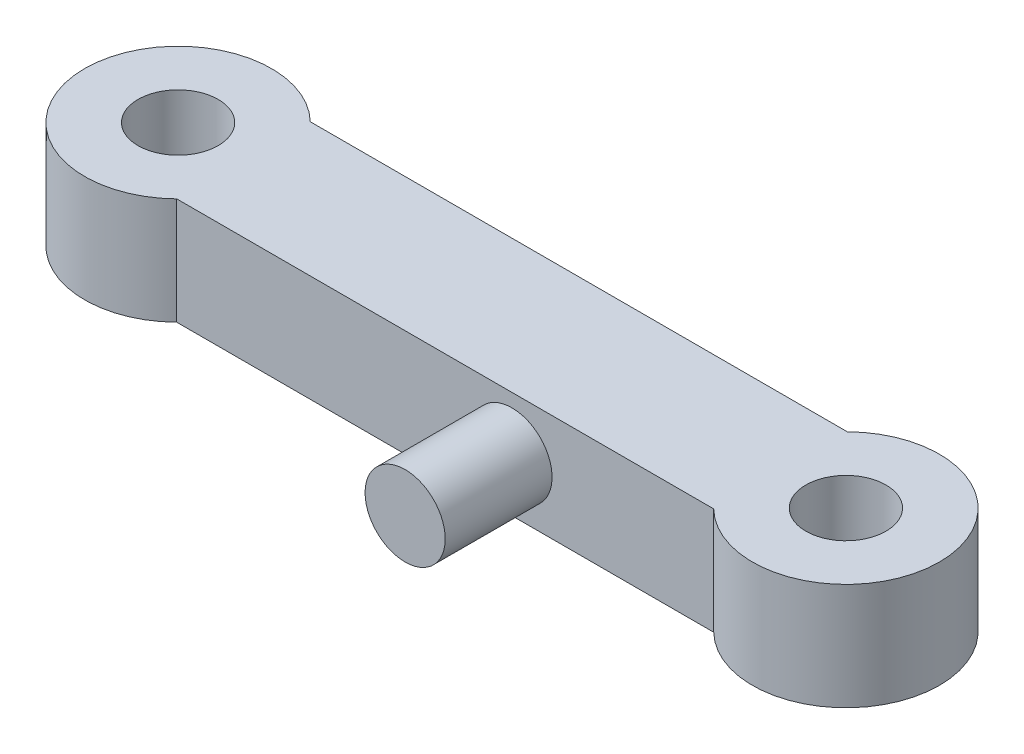
ISO-10303-21;
HEADER;
FILE_DESCRIPTION(('STEP AP214'),'2;1');
FILE_NAME('part.step','',(''),(''),'','','');
FILE_SCHEMA(('AUTOMOTIVE_DESIGN { 1 0 10303 214 1 1 1 1 }'));
ENDSEC;
DATA;
#1=APPLICATION_CONTEXT('core data for automotive mechanical design processes');
#2=APPLICATION_PROTOCOL_DEFINITION('international standard','automotive_design',2000,#1);
#3=PRODUCT_CONTEXT('',#1,'mechanical');
#4=PRODUCT('Part','Part','',(#3));
#5=PRODUCT_RELATED_PRODUCT_CATEGORY('part','',(#4));
#6=PRODUCT_DEFINITION_FORMATION('','',#4);
#7=PRODUCT_DEFINITION_CONTEXT('part definition',#1,'design');
#8=PRODUCT_DEFINITION('design','',#6,#7);
#9=PRODUCT_DEFINITION_SHAPE('','',#8);
#10=(LENGTH_UNIT() NAMED_UNIT(*) SI_UNIT(.MILLI.,.METRE.));
#11=(NAMED_UNIT(*) PLANE_ANGLE_UNIT() SI_UNIT($,.RADIAN.));
#12=(NAMED_UNIT(*) SI_UNIT($,.STERADIAN.) SOLID_ANGLE_UNIT());
#13=UNCERTAINTY_MEASURE_WITH_UNIT(LENGTH_MEASURE(1.E-05),#10,'distance_accuracy_value','');
#14=(GEOMETRIC_REPRESENTATION_CONTEXT(3) GLOBAL_UNCERTAINTY_ASSIGNED_CONTEXT((#13)) GLOBAL_UNIT_ASSIGNED_CONTEXT((#10,
#11,#12)) REPRESENTATION_CONTEXT('',''));
#15=CARTESIAN_POINT('',(0.,0.,0.));
#16=DIRECTION('',(0.,0.,1.));
#17=DIRECTION('',(1.,0.,0.));
#18=AXIS2_PLACEMENT_3D('',#15,#16,#17);
#19=CARTESIAN_POINT('',(12.5,4.,0.));
#20=DIRECTION('',(0.,-1.,0.));
#21=DIRECTION('',(0.,0.,-1.));
#22=AXIS2_PLACEMENT_3D('',#19,#20,#21);
#23=PLANE('',#22);
#24=CARTESIAN_POINT('',(12.5,4.,0.));
#25=DIRECTION('',(0.,1.,0.));
#26=DIRECTION('',(0.,0.,-1.));
#27=AXIS2_PLACEMENT_3D('',#24,#25,#26);
#28=CIRCLE('',#27,3.5);
#29=CARTESIAN_POINT('',(10.0505102572168,4.,2.5));
#30=VERTEX_POINT('',#29);
#31=CARTESIAN_POINT('',(10.0505102572168,4.,-2.5));
#32=VERTEX_POINT('',#31);
#33=EDGE_CURVE('E99',#30,#32,#28,.T.);
#34=ORIENTED_EDGE('',*,*,#33,.T.);
#35=DIRECTION('',(-1.,0.,0.));
#36=VECTOR('',#35,1.);
#37=CARTESIAN_POINT('',(-10.0505102572168,4.,-2.5));
#38=LINE('',#37,#36);
#39=CARTESIAN_POINT('',(-10.0505102572168,4.,-2.5));
#40=VERTEX_POINT('',#39);
#41=EDGE_CURVE('E94',#32,#40,#38,.T.);
#42=ORIENTED_EDGE('',*,*,#41,.T.);
#43=CARTESIAN_POINT('',(-12.5,4.,0.));
#44=DIRECTION('',(0.,1.,0.));
#45=DIRECTION('',(0.,0.,-1.));
#46=AXIS2_PLACEMENT_3D('',#43,#44,#45);
#47=CIRCLE('',#46,3.5);
#48=CARTESIAN_POINT('',(-10.0505102572168,4.,2.5));
#49=VERTEX_POINT('',#48);
#50=EDGE_CURVE('E97',#40,#49,#47,.T.);
#51=ORIENTED_EDGE('',*,*,#50,.T.);
#52=DIRECTION('',(1.,0.,0.));
#53=VECTOR('',#52,1.);
#54=CARTESIAN_POINT('',(-10.0505102572168,4.,2.5));
#55=LINE('',#54,#53);
#56=EDGE_CURVE('E63',#49,#30,#55,.T.);
#57=ORIENTED_EDGE('',*,*,#56,.T.);
#58=EDGE_LOOP('',(#34,#42,#51,#57));
#59=FACE_BOUND('',#58,.T.);
#60=CARTESIAN_POINT('',(12.5,4.,0.));
#61=DIRECTION('',(0.,1.,0.));
#62=DIRECTION('',(0.,0.,1.));
#63=AXIS2_PLACEMENT_3D('',#60,#61,#62);
#64=CIRCLE('',#63,1.5);
#65=CARTESIAN_POINT('',(12.5,4.,1.5));
#66=VERTEX_POINT('',#65);
#67=EDGE_CURVE('E121',#66,#66,#64,.T.);
#68=ORIENTED_EDGE('',*,*,#67,.F.);
#69=EDGE_LOOP('',(#68));
#70=FACE_BOUND('',#69,.T.);
#71=CARTESIAN_POINT('',(-12.5,4.,0.));
#72=DIRECTION('',(0.,1.,0.));
#73=DIRECTION('',(0.,0.,1.));
#74=AXIS2_PLACEMENT_3D('',#71,#72,#73);
#75=CIRCLE('',#74,1.5);
#76=CARTESIAN_POINT('',(-12.5,4.,1.5));
#77=VERTEX_POINT('',#76);
#78=EDGE_CURVE('E145',#77,#77,#75,.T.);
#79=ORIENTED_EDGE('',*,*,#78,.F.);
#80=EDGE_LOOP('',(#79));
#81=FACE_BOUND('',#80,.T.);
#82=ADVANCED_FACE('F45',(#59,#70,#81),#23,.F.);
#83=CARTESIAN_POINT('',(12.5,0.,0.));
#84=DIRECTION('',(0.,-1.,0.));
#85=DIRECTION('',(0.,0.,-1.));
#86=AXIS2_PLACEMENT_3D('',#83,#84,#85);
#87=PLANE('',#86);
#88=CARTESIAN_POINT('',(12.5,0.,0.));
#89=DIRECTION('',(0.,1.,0.));
#90=DIRECTION('',(0.,0.,1.));
#91=AXIS2_PLACEMENT_3D('',#88,#89,#90);
#92=CIRCLE('',#91,1.5);
#93=CARTESIAN_POINT('',(12.5,0.,1.5));
#94=VERTEX_POINT('',#93);
#95=EDGE_CURVE('E151',#94,#94,#92,.T.);
#96=ORIENTED_EDGE('',*,*,#95,.T.);
#97=EDGE_LOOP('',(#96));
#98=FACE_BOUND('',#97,.T.);
#99=CARTESIAN_POINT('',(12.5,0.,0.));
#100=DIRECTION('',(0.,1.,0.));
#101=DIRECTION('',(0.,0.,-1.));
#102=AXIS2_PLACEMENT_3D('',#99,#100,#101);
#103=CIRCLE('',#102,3.5);
#104=CARTESIAN_POINT('',(10.0505102572168,0.,2.5));
#105=VERTEX_POINT('',#104);
#106=CARTESIAN_POINT('',(10.0505102572168,0.,-2.5));
#107=VERTEX_POINT('',#106);
#108=EDGE_CURVE('E117',#105,#107,#103,.T.);
#109=ORIENTED_EDGE('',*,*,#108,.F.);
#110=DIRECTION('',(1.,0.,0.));
#111=VECTOR('',#110,1.);
#112=CARTESIAN_POINT('',(-10.0505102572168,0.,2.5));
#113=LINE('',#112,#111);
#114=CARTESIAN_POINT('',(-10.0505102572168,0.,2.5));
#115=VERTEX_POINT('',#114);
#116=EDGE_CURVE('E86',#115,#105,#113,.T.);
#117=ORIENTED_EDGE('',*,*,#116,.F.);
#118=CARTESIAN_POINT('',(-12.5,0.,0.));
#119=DIRECTION('',(0.,1.,0.));
#120=DIRECTION('',(0.,0.,-1.));
#121=AXIS2_PLACEMENT_3D('',#118,#119,#120);
#122=CIRCLE('',#121,3.5);
#123=CARTESIAN_POINT('',(-10.0505102572168,0.,-2.5));
#124=VERTEX_POINT('',#123);
#125=EDGE_CURVE('E80',#124,#115,#122,.T.);
#126=ORIENTED_EDGE('',*,*,#125,.F.);
#127=DIRECTION('',(-1.,0.,0.));
#128=VECTOR('',#127,1.);
#129=CARTESIAN_POINT('',(-10.0505102572168,0.,-2.5));
#130=LINE('',#129,#128);
#131=EDGE_CURVE('E105',#107,#124,#130,.T.);
#132=ORIENTED_EDGE('',*,*,#131,.F.);
#133=EDGE_LOOP('',(#109,#117,#126,#132));
#134=FACE_BOUND('',#133,.T.);
#135=CARTESIAN_POINT('',(-12.5,0.,0.));
#136=DIRECTION('',(0.,1.,0.));
#137=DIRECTION('',(0.,0.,1.));
#138=AXIS2_PLACEMENT_3D('',#135,#136,#137);
#139=CIRCLE('',#138,1.5);
#140=CARTESIAN_POINT('',(-12.5,0.,1.5));
#141=VERTEX_POINT('',#140);
#142=EDGE_CURVE('E142',#141,#141,#139,.T.);
#143=ORIENTED_EDGE('',*,*,#142,.T.);
#144=EDGE_LOOP('',(#143));
#145=FACE_BOUND('',#144,.T.);
#146=ADVANCED_FACE('F135',(#98,#134,#145),#87,.T.);
#147=CARTESIAN_POINT('',(12.5,4.,0.));
#148=DIRECTION('',(0.,-1.,0.));
#149=DIRECTION('',(0.,0.,-1.));
#150=AXIS2_PLACEMENT_3D('',#147,#148,#149);
#151=CYLINDRICAL_SURFACE('',#150,3.5);
#152=ORIENTED_EDGE('',*,*,#108,.T.);
#153=DIRECTION('',(0.,-1.,0.));
#154=VECTOR('',#153,1.);
#155=CARTESIAN_POINT('',(10.0505102572168,4.,-2.5));
#156=LINE('',#155,#154);
#157=EDGE_CURVE('E55',#32,#107,#156,.T.);
#158=ORIENTED_EDGE('',*,*,#157,.F.);
#159=ORIENTED_EDGE('',*,*,#33,.F.);
#160=DIRECTION('',(0.,-1.,0.));
#161=VECTOR('',#160,1.);
#162=CARTESIAN_POINT('',(10.0505102572168,4.,2.5));
#163=LINE('',#162,#161);
#164=EDGE_CURVE('E113',#30,#105,#163,.T.);
#165=ORIENTED_EDGE('',*,*,#164,.T.);
#166=EDGE_LOOP('',(#152,#158,#159,#165));
#167=FACE_BOUND('',#166,.T.);
#168=ADVANCED_FACE('F47',(#167),#151,.T.);
#169=CARTESIAN_POINT('',(-10.0505102572168,4.,-2.5));
#170=DIRECTION('',(0.,0.,1.));
#171=DIRECTION('',(1.,0.,0.));
#172=AXIS2_PLACEMENT_3D('',#169,#170,#171);
#173=PLANE('',#172);
#174=ORIENTED_EDGE('',*,*,#131,.T.);
#175=DIRECTION('',(0.,-1.,0.));
#176=VECTOR('',#175,1.);
#177=CARTESIAN_POINT('',(-10.0505102572168,4.,-2.5));
#178=LINE('',#177,#176);
#179=EDGE_CURVE('E103',#40,#124,#178,.T.);
#180=ORIENTED_EDGE('',*,*,#179,.F.);
#181=ORIENTED_EDGE('',*,*,#41,.F.);
#182=ORIENTED_EDGE('',*,*,#157,.T.);
#183=EDGE_LOOP('',(#174,#180,#181,#182));
#184=FACE_BOUND('',#183,.T.);
#185=ADVANCED_FACE('F104',(#184),#173,.F.);
#186=CARTESIAN_POINT('',(-12.5,4.,0.));
#187=DIRECTION('',(0.,-1.,0.));
#188=DIRECTION('',(0.,0.,-1.));
#189=AXIS2_PLACEMENT_3D('',#186,#187,#188);
#190=CYLINDRICAL_SURFACE('',#189,3.5);
#191=ORIENTED_EDGE('',*,*,#125,.T.);
#192=DIRECTION('',(0.,-1.,0.));
#193=VECTOR('',#192,1.);
#194=CARTESIAN_POINT('',(-10.0505102572168,4.,2.5));
#195=LINE('',#194,#193);
#196=EDGE_CURVE('E107',#49,#115,#195,.T.);
#197=ORIENTED_EDGE('',*,*,#196,.F.);
#198=ORIENTED_EDGE('',*,*,#50,.F.);
#199=ORIENTED_EDGE('',*,*,#179,.T.);
#200=EDGE_LOOP('',(#191,#197,#198,#199));
#201=FACE_BOUND('',#200,.T.);
#202=ADVANCED_FACE('F109',(#201),#190,.T.);
#203=CARTESIAN_POINT('',(-10.0505102572168,4.,2.5));
#204=DIRECTION('',(0.,0.,-1.));
#205=DIRECTION('',(-1.,0.,0.));
#206=AXIS2_PLACEMENT_3D('',#203,#204,#205);
#207=PLANE('',#206);
#208=CARTESIAN_POINT('',(2.49999999999995,2.,2.5));
#209=DIRECTION('',(0.,0.,-1.));
#210=DIRECTION('',(-1.,0.,0.));
#211=AXIS2_PLACEMENT_3D('',#208,#209,#210);
#212=CIRCLE('',#211,1.5);
#213=CARTESIAN_POINT('',(0.999999999999946,2.,2.5));
#214=VERTEX_POINT('',#213);
#215=EDGE_CURVE('E11',#214,#214,#212,.F.);
#216=ORIENTED_EDGE('',*,*,#215,.F.);
#217=EDGE_LOOP('',(#216));
#218=FACE_BOUND('',#217,.T.);
#219=ORIENTED_EDGE('',*,*,#116,.T.);
#220=ORIENTED_EDGE('',*,*,#164,.F.);
#221=ORIENTED_EDGE('',*,*,#56,.F.);
#222=ORIENTED_EDGE('',*,*,#196,.T.);
#223=EDGE_LOOP('',(#219,#220,#221,#222));
#224=FACE_BOUND('',#223,.T.);
#225=ADVANCED_FACE('F167',(#218,#224),#207,.F.);
#226=CARTESIAN_POINT('',(12.5,4.,0.));
#227=DIRECTION('',(0.,-1.,0.));
#228=DIRECTION('',(0.,0.,-1.));
#229=AXIS2_PLACEMENT_3D('',#226,#227,#228);
#230=CYLINDRICAL_SURFACE('',#229,1.5);
#231=ORIENTED_EDGE('',*,*,#67,.T.);
#232=EDGE_LOOP('',(#231));
#233=FACE_BOUND('',#232,.T.);
#234=ORIENTED_EDGE('',*,*,#95,.F.);
#235=EDGE_LOOP('',(#234));
#236=FACE_BOUND('',#235,.T.);
#237=ADVANCED_FACE('F164',(#233,#236),#230,.F.);
#238=CARTESIAN_POINT('',(-12.5,4.,0.));
#239=DIRECTION('',(0.,-1.,0.));
#240=DIRECTION('',(0.,0.,-1.));
#241=AXIS2_PLACEMENT_3D('',#238,#239,#240);
#242=CYLINDRICAL_SURFACE('',#241,1.5);
#243=ORIENTED_EDGE('',*,*,#78,.T.);
#244=EDGE_LOOP('',(#243));
#245=FACE_BOUND('',#244,.T.);
#246=ORIENTED_EDGE('',*,*,#142,.F.);
#247=EDGE_LOOP('',(#246));
#248=FACE_BOUND('',#247,.T.);
#249=ADVANCED_FACE('F166',(#245,#248),#242,.F.);
#250=CARTESIAN_POINT('',(2.49999999999995,2.,6.5));
#251=DIRECTION('',(0.,0.,-1.));
#252=DIRECTION('',(-1.,0.,0.));
#253=AXIS2_PLACEMENT_3D('',#250,#251,#252);
#254=CYLINDRICAL_SURFACE('',#253,1.5);
#255=CARTESIAN_POINT('',(2.49999999999995,2.,6.5));
#256=DIRECTION('',(0.,0.,1.));
#257=DIRECTION('',(1.,0.,0.));
#258=AXIS2_PLACEMENT_3D('',#255,#256,#257);
#259=CIRCLE('',#258,1.5);
#260=CARTESIAN_POINT('',(3.99999999999995,2.,6.5));
#261=VERTEX_POINT('',#260);
#262=EDGE_CURVE('E146',#261,#261,#259,.T.);
#263=ORIENTED_EDGE('',*,*,#262,.F.);
#264=EDGE_LOOP('',(#263));
#265=FACE_BOUND('',#264,.T.);
#266=ORIENTED_EDGE('',*,*,#215,.T.);
#267=EDGE_LOOP('',(#266));
#268=FACE_BOUND('',#267,.T.);
#269=ADVANCED_FACE('F174',(#265,#268),#254,.T.);
#270=CARTESIAN_POINT('',(2.49999999999995,2.,6.5));
#271=DIRECTION('',(0.,0.,1.));
#272=DIRECTION('',(1.,0.,0.));
#273=AXIS2_PLACEMENT_3D('',#270,#271,#272);
#274=PLANE('',#273);
#275=ORIENTED_EDGE('',*,*,#262,.T.);
#276=EDGE_LOOP('',(#275));
#277=FACE_BOUND('',#276,.T.);
#278=ADVANCED_FACE('F233',(#277),#274,.T.);
#279=CLOSED_SHELL('',(#82,#146,#168,#185,#202,#225,#237,#249,#269,#278));
#280=MANIFOLD_SOLID_BREP('B2',#279);
#281=ADVANCED_BREP_SHAPE_REPRESENTATION('',(#18,#280),#14);
#282=SHAPE_DEFINITION_REPRESENTATION(#9,#281);
ENDSEC;
END-ISO-10303-21;
